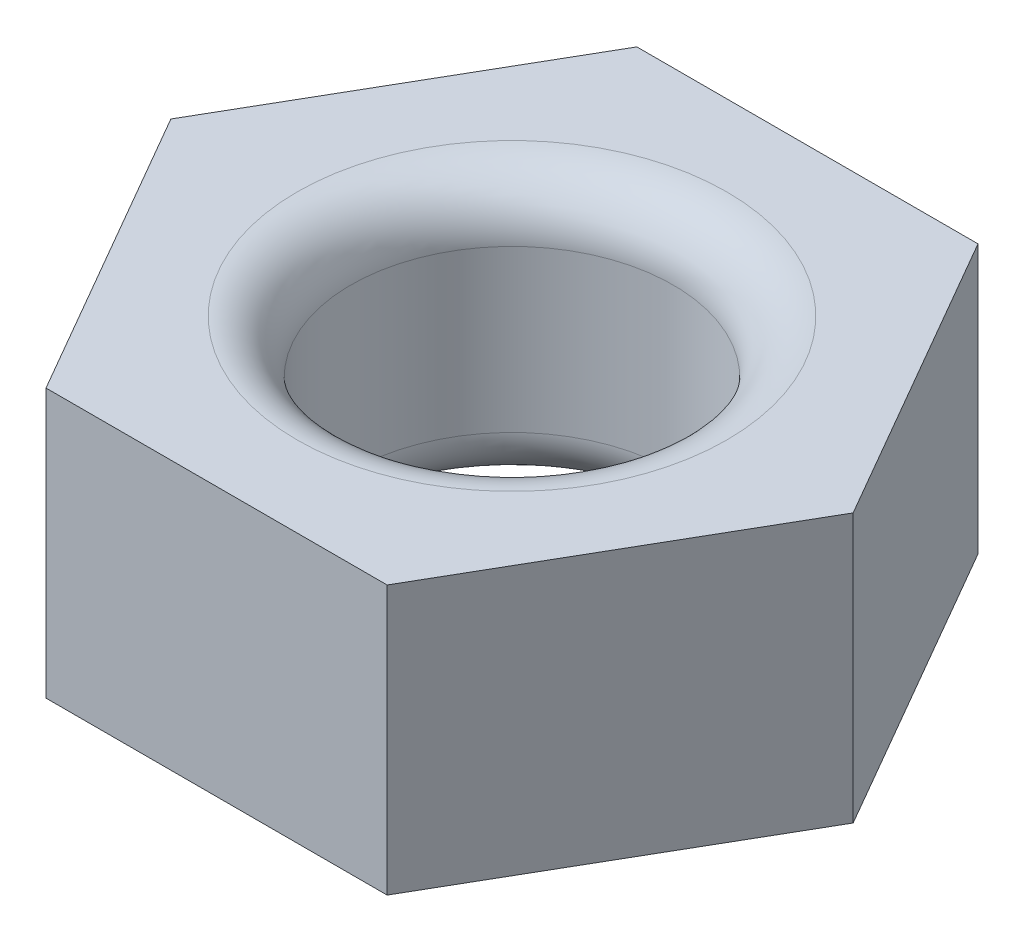
ISO-10303-21;
HEADER;
FILE_DESCRIPTION(('STEP AP214'),'2;1');
FILE_NAME('part.step','',(''),(''),'','','');
FILE_SCHEMA(('AUTOMOTIVE_DESIGN { 1 0 10303 214 1 1 1 1 }'));
ENDSEC;
DATA;
#1=APPLICATION_CONTEXT('core data for automotive mechanical design processes');
#2=APPLICATION_PROTOCOL_DEFINITION('international standard','automotive_design',2000,#1);
#3=PRODUCT_CONTEXT('',#1,'mechanical');
#4=PRODUCT('Part','Part','',(#3));
#5=PRODUCT_RELATED_PRODUCT_CATEGORY('part','',(#4));
#6=PRODUCT_DEFINITION_FORMATION('','',#4);
#7=PRODUCT_DEFINITION_CONTEXT('part definition',#1,'design');
#8=PRODUCT_DEFINITION('design','',#6,#7);
#9=PRODUCT_DEFINITION_SHAPE('','',#8);
#10=(LENGTH_UNIT() NAMED_UNIT(*) SI_UNIT(.MILLI.,.METRE.));
#11=(NAMED_UNIT(*) PLANE_ANGLE_UNIT() SI_UNIT($,.RADIAN.));
#12=(NAMED_UNIT(*) SI_UNIT($,.STERADIAN.) SOLID_ANGLE_UNIT());
#13=UNCERTAINTY_MEASURE_WITH_UNIT(LENGTH_MEASURE(1.E-05),#10,'distance_accuracy_value','');
#14=(GEOMETRIC_REPRESENTATION_CONTEXT(3) GLOBAL_UNCERTAINTY_ASSIGNED_CONTEXT((#13)) GLOBAL_UNIT_ASSIGNED_CONTEXT((#10,
#11,#12)) REPRESENTATION_CONTEXT('',''));
#15=CARTESIAN_POINT('',(0.,0.,0.));
#16=DIRECTION('',(0.,0.,1.));
#17=DIRECTION('',(1.,0.,0.));
#18=AXIS2_PLACEMENT_3D('',#15,#16,#17);
#19=CARTESIAN_POINT('',(0.,2.5,0.));
#20=DIRECTION('',(0.,1.,0.));
#21=DIRECTION('',(0.,0.,1.));
#22=AXIS2_PLACEMENT_3D('',#19,#20,#21);
#23=PLANE('',#22);
#24=CARTESIAN_POINT('',(0.,2.5,0.));
#25=DIRECTION('',(0.,1.,0.));
#26=DIRECTION('',(0.,0.,1.));
#27=AXIS2_PLACEMENT_3D('',#24,#25,#26);
#28=CIRCLE('',#27,2.);
#29=CARTESIAN_POINT('',(0.,2.5,2.));
#30=VERTEX_POINT('',#29);
#31=EDGE_CURVE('E11',#30,#30,#28,.F.);
#32=ORIENTED_EDGE('',*,*,#31,.T.);
#33=EDGE_LOOP('',(#32));
#34=FACE_BOUND('',#33,.T.);
#35=DIRECTION('',(-0.5,0.,0.866025403784439));
#36=VECTOR('',#35,1.);
#37=CARTESIAN_POINT('',(-1.58771324027147,2.5,-2.75));
#38=LINE('',#37,#36);
#39=CARTESIAN_POINT('',(-1.58771324027147,2.5,-2.75));
#40=VERTEX_POINT('',#39);
#41=CARTESIAN_POINT('',(-3.17542648054294,2.5,0.));
#42=VERTEX_POINT('',#41);
#43=EDGE_CURVE('E128',#40,#42,#38,.T.);
#44=ORIENTED_EDGE('',*,*,#43,.T.);
#45=DIRECTION('',(0.5,0.,0.866025403784439));
#46=VECTOR('',#45,1.);
#47=CARTESIAN_POINT('',(-3.17542648054294,2.5,0.));
#48=LINE('',#47,#46);
#49=CARTESIAN_POINT('',(-1.58771324027147,2.5,2.75));
#50=VERTEX_POINT('',#49);
#51=EDGE_CURVE('E88',#42,#50,#48,.T.);
#52=ORIENTED_EDGE('',*,*,#51,.T.);
#53=DIRECTION('',(1.,0.,0.));
#54=VECTOR('',#53,1.);
#55=CARTESIAN_POINT('',(-1.58771324027147,2.5,2.75));
#56=LINE('',#55,#54);
#57=CARTESIAN_POINT('',(1.58771324027147,2.5,2.75));
#58=VERTEX_POINT('',#57);
#59=EDGE_CURVE('E100',#50,#58,#56,.T.);
#60=ORIENTED_EDGE('',*,*,#59,.T.);
#61=DIRECTION('',(0.5,0.,-0.866025403784439));
#62=VECTOR('',#61,1.);
#63=CARTESIAN_POINT('',(1.58771324027147,2.5,2.75));
#64=LINE('',#63,#62);
#65=CARTESIAN_POINT('',(3.17542648054294,2.5,0.));
#66=VERTEX_POINT('',#65);
#67=EDGE_CURVE('E95',#58,#66,#64,.T.);
#68=ORIENTED_EDGE('',*,*,#67,.T.);
#69=DIRECTION('',(-0.5,0.,-0.866025403784439));
#70=VECTOR('',#69,1.);
#71=CARTESIAN_POINT('',(3.17542648054294,2.5,0.));
#72=LINE('',#71,#70);
#73=CARTESIAN_POINT('',(1.58771324027147,2.5,-2.75));
#74=VERTEX_POINT('',#73);
#75=EDGE_CURVE('E98',#66,#74,#72,.T.);
#76=ORIENTED_EDGE('',*,*,#75,.T.);
#77=DIRECTION('',(-1.,0.,0.));
#78=VECTOR('',#77,1.);
#79=CARTESIAN_POINT('',(1.58771324027147,2.5,-2.75));
#80=LINE('',#79,#78);
#81=EDGE_CURVE('E50',#74,#40,#80,.T.);
#82=ORIENTED_EDGE('',*,*,#81,.T.);
#83=EDGE_LOOP('',(#44,#52,#60,#68,#76,#82));
#84=FACE_BOUND('',#83,.T.);
#85=ADVANCED_FACE('F33',(#34,#84),#23,.T.);
#86=CARTESIAN_POINT('',(0.,0.,0.));
#87=DIRECTION('',(0.,1.,0.));
#88=DIRECTION('',(0.,0.,1.));
#89=AXIS2_PLACEMENT_3D('',#86,#87,#88);
#90=PLANE('',#89);
#91=CARTESIAN_POINT('',(0.,0.,0.));
#92=DIRECTION('',(0.,1.,0.));
#93=DIRECTION('',(0.,0.,1.));
#94=AXIS2_PLACEMENT_3D('',#91,#92,#93);
#95=CIRCLE('',#94,2.);
#96=CARTESIAN_POINT('',(0.,0.,2.));
#97=VERTEX_POINT('',#96);
#98=EDGE_CURVE('E137',#97,#97,#95,.T.);
#99=ORIENTED_EDGE('',*,*,#98,.T.);
#100=EDGE_LOOP('',(#99));
#101=FACE_BOUND('',#100,.T.);
#102=DIRECTION('',(-0.5,0.,0.866025403784439));
#103=VECTOR('',#102,1.);
#104=CARTESIAN_POINT('',(-1.58771324027147,0.,-2.75));
#105=LINE('',#104,#103);
#106=CARTESIAN_POINT('',(-1.58771324027147,0.,-2.75));
#107=VERTEX_POINT('',#106);
#108=CARTESIAN_POINT('',(-3.17542648054294,0.,0.));
#109=VERTEX_POINT('',#108);
#110=EDGE_CURVE('E118',#107,#109,#105,.T.);
#111=ORIENTED_EDGE('',*,*,#110,.F.);
#112=DIRECTION('',(-1.,0.,0.));
#113=VECTOR('',#112,1.);
#114=CARTESIAN_POINT('',(1.58771324027147,0.,-2.75));
#115=LINE('',#114,#113);
#116=CARTESIAN_POINT('',(1.58771324027147,0.,-2.75));
#117=VERTEX_POINT('',#116);
#118=EDGE_CURVE('E79',#117,#107,#115,.T.);
#119=ORIENTED_EDGE('',*,*,#118,.F.);
#120=DIRECTION('',(-0.5,0.,-0.866025403784439));
#121=VECTOR('',#120,1.);
#122=CARTESIAN_POINT('',(3.17542648054294,0.,0.));
#123=LINE('',#122,#121);
#124=CARTESIAN_POINT('',(3.17542648054294,0.,0.));
#125=VERTEX_POINT('',#124);
#126=EDGE_CURVE('E73',#125,#117,#123,.T.);
#127=ORIENTED_EDGE('',*,*,#126,.F.);
#128=DIRECTION('',(0.5,0.,-0.866025403784439));
#129=VECTOR('',#128,1.);
#130=CARTESIAN_POINT('',(1.58771324027147,0.,2.75));
#131=LINE('',#130,#129);
#132=CARTESIAN_POINT('',(1.58771324027147,0.,2.75));
#133=VERTEX_POINT('',#132);
#134=EDGE_CURVE('E108',#133,#125,#131,.T.);
#135=ORIENTED_EDGE('',*,*,#134,.F.);
#136=DIRECTION('',(1.,0.,0.));
#137=VECTOR('',#136,1.);
#138=CARTESIAN_POINT('',(-1.58771324027147,0.,2.75));
#139=LINE('',#138,#137);
#140=CARTESIAN_POINT('',(-1.58771324027147,0.,2.75));
#141=VERTEX_POINT('',#140);
#142=EDGE_CURVE('E123',#141,#133,#139,.T.);
#143=ORIENTED_EDGE('',*,*,#142,.F.);
#144=DIRECTION('',(0.5,0.,0.866025403784439));
#145=VECTOR('',#144,1.);
#146=CARTESIAN_POINT('',(-3.17542648054294,0.,0.));
#147=LINE('',#146,#145);
#148=EDGE_CURVE('E121',#109,#141,#147,.T.);
#149=ORIENTED_EDGE('',*,*,#148,.F.);
#150=EDGE_LOOP('',(#111,#119,#127,#135,#143,#149));
#151=FACE_BOUND('',#150,.T.);
#152=ADVANCED_FACE('F153',(#101,#151),#90,.F.);
#153=CARTESIAN_POINT('',(-1.58771324027147,2.5,-2.75));
#154=DIRECTION('',(0.866025403784439,0.,0.5));
#155=DIRECTION('',(0.5,0.,-0.866025403784439));
#156=AXIS2_PLACEMENT_3D('',#153,#154,#155);
#157=PLANE('',#156);
#158=ORIENTED_EDGE('',*,*,#110,.T.);
#159=DIRECTION('',(0.,-1.,0.));
#160=VECTOR('',#159,1.);
#161=CARTESIAN_POINT('',(-3.17542648054294,2.5,0.));
#162=LINE('',#161,#160);
#163=EDGE_CURVE('E135',#42,#109,#162,.T.);
#164=ORIENTED_EDGE('',*,*,#163,.F.);
#165=ORIENTED_EDGE('',*,*,#43,.F.);
#166=DIRECTION('',(0.,-1.,0.));
#167=VECTOR('',#166,1.);
#168=CARTESIAN_POINT('',(-1.58771324027147,2.5,-2.75));
#169=LINE('',#168,#167);
#170=EDGE_CURVE('E114',#40,#107,#169,.T.);
#171=ORIENTED_EDGE('',*,*,#170,.T.);
#172=EDGE_LOOP('',(#158,#164,#165,#171));
#173=FACE_BOUND('',#172,.T.);
#174=ADVANCED_FACE('F156',(#173),#157,.F.);
#175=CARTESIAN_POINT('',(-3.17542648054294,2.5,0.));
#176=DIRECTION('',(0.866025403784438,0.,-0.5));
#177=DIRECTION('',(-0.5,0.,-0.866025403784439));
#178=AXIS2_PLACEMENT_3D('',#175,#176,#177);
#179=PLANE('',#178);
#180=ORIENTED_EDGE('',*,*,#148,.T.);
#181=DIRECTION('',(0.,-1.,0.));
#182=VECTOR('',#181,1.);
#183=CARTESIAN_POINT('',(-1.58771324027147,2.5,2.75));
#184=LINE('',#183,#182);
#185=EDGE_CURVE('E132',#50,#141,#184,.T.);
#186=ORIENTED_EDGE('',*,*,#185,.F.);
#187=ORIENTED_EDGE('',*,*,#51,.F.);
#188=ORIENTED_EDGE('',*,*,#163,.T.);
#189=EDGE_LOOP('',(#180,#186,#187,#188));
#190=FACE_BOUND('',#189,.T.);
#191=ADVANCED_FACE('F232',(#190),#179,.F.);
#192=CARTESIAN_POINT('',(-1.58771324027147,2.5,2.75));
#193=DIRECTION('',(0.,0.,-1.));
#194=DIRECTION('',(-1.,0.,0.));
#195=AXIS2_PLACEMENT_3D('',#192,#193,#194);
#196=PLANE('',#195);
#197=ORIENTED_EDGE('',*,*,#142,.T.);
#198=DIRECTION('',(0.,-1.,0.));
#199=VECTOR('',#198,1.);
#200=CARTESIAN_POINT('',(1.58771324027147,2.5,2.75));
#201=LINE('',#200,#199);
#202=EDGE_CURVE('E109',#58,#133,#201,.T.);
#203=ORIENTED_EDGE('',*,*,#202,.F.);
#204=ORIENTED_EDGE('',*,*,#59,.F.);
#205=ORIENTED_EDGE('',*,*,#185,.T.);
#206=EDGE_LOOP('',(#197,#203,#204,#205));
#207=FACE_BOUND('',#206,.T.);
#208=ADVANCED_FACE('F223',(#207),#196,.F.);
#209=CARTESIAN_POINT('',(1.58771324027147,2.5,2.75));
#210=DIRECTION('',(-0.866025403784439,0.,-0.5));
#211=DIRECTION('',(-0.5,0.,0.866025403784439));
#212=AXIS2_PLACEMENT_3D('',#209,#210,#211);
#213=PLANE('',#212);
#214=ORIENTED_EDGE('',*,*,#134,.T.);
#215=DIRECTION('',(0.,-1.,0.));
#216=VECTOR('',#215,1.);
#217=CARTESIAN_POINT('',(3.17542648054294,2.5,0.));
#218=LINE('',#217,#216);
#219=EDGE_CURVE('E105',#66,#125,#218,.T.);
#220=ORIENTED_EDGE('',*,*,#219,.F.);
#221=ORIENTED_EDGE('',*,*,#67,.F.);
#222=ORIENTED_EDGE('',*,*,#202,.T.);
#223=EDGE_LOOP('',(#214,#220,#221,#222));
#224=FACE_BOUND('',#223,.T.);
#225=ADVANCED_FACE('F106',(#224),#213,.F.);
#226=CARTESIAN_POINT('',(3.17542648054294,2.5,0.));
#227=DIRECTION('',(-0.866025403784439,0.,0.5));
#228=DIRECTION('',(0.5,0.,0.866025403784439));
#229=AXIS2_PLACEMENT_3D('',#226,#227,#228);
#230=PLANE('',#229);
#231=ORIENTED_EDGE('',*,*,#126,.T.);
#232=DIRECTION('',(0.,-1.,0.));
#233=VECTOR('',#232,1.);
#234=CARTESIAN_POINT('',(1.58771324027147,2.5,-2.75));
#235=LINE('',#234,#233);
#236=EDGE_CURVE('E110',#74,#117,#235,.T.);
#237=ORIENTED_EDGE('',*,*,#236,.F.);
#238=ORIENTED_EDGE('',*,*,#75,.F.);
#239=ORIENTED_EDGE('',*,*,#219,.T.);
#240=EDGE_LOOP('',(#231,#237,#238,#239));
#241=FACE_BOUND('',#240,.T.);
#242=ADVANCED_FACE('F112',(#241),#230,.F.);
#243=CARTESIAN_POINT('',(1.58771324027147,2.5,-2.75));
#244=DIRECTION('',(0.,0.,1.));
#245=DIRECTION('',(1.,0.,0.));
#246=AXIS2_PLACEMENT_3D('',#243,#244,#245);
#247=PLANE('',#246);
#248=ORIENTED_EDGE('',*,*,#118,.T.);
#249=ORIENTED_EDGE('',*,*,#170,.F.);
#250=ORIENTED_EDGE('',*,*,#81,.F.);
#251=ORIENTED_EDGE('',*,*,#236,.T.);
#252=EDGE_LOOP('',(#248,#249,#250,#251));
#253=FACE_BOUND('',#252,.T.);
#254=ADVANCED_FACE('F163',(#253),#247,.F.);
#255=CARTESIAN_POINT('',(0.,2.5,0.));
#256=DIRECTION('',(0.,-1.,0.));
#257=DIRECTION('',(0.,0.,-1.));
#258=AXIS2_PLACEMENT_3D('',#255,#256,#257);
#259=CYLINDRICAL_SURFACE('',#258,1.5);
#260=CARTESIAN_POINT('',(0.,0.5,0.));
#261=DIRECTION('',(0.,1.,0.));
#262=DIRECTION('',(0.,0.,1.));
#263=AXIS2_PLACEMENT_3D('',#260,#261,#262);
#264=CIRCLE('',#263,1.5);
#265=CARTESIAN_POINT('',(0.,0.5,1.5));
#266=VERTEX_POINT('',#265);
#267=EDGE_CURVE('E42',#266,#266,#264,.F.);
#268=ORIENTED_EDGE('',*,*,#267,.T.);
#269=EDGE_LOOP('',(#268));
#270=FACE_BOUND('',#269,.T.);
#271=CARTESIAN_POINT('',(0.,2.,0.));
#272=DIRECTION('',(0.,1.,0.));
#273=DIRECTION('',(0.,0.,1.));
#274=AXIS2_PLACEMENT_3D('',#271,#272,#273);
#275=CIRCLE('',#274,1.5);
#276=CARTESIAN_POINT('',(0.,2.,1.5));
#277=VERTEX_POINT('',#276);
#278=EDGE_CURVE('E140',#277,#277,#275,.T.);
#279=ORIENTED_EDGE('',*,*,#278,.T.);
#280=EDGE_LOOP('',(#279));
#281=FACE_BOUND('',#280,.T.);
#282=ADVANCED_FACE('F145',(#270,#281),#259,.F.);
#283=CARTESIAN_POINT('',(0.,0.5,0.));
#284=DIRECTION('',(0.,1.,0.));
#285=DIRECTION('',(0.,0.,1.));
#286=AXIS2_PLACEMENT_3D('',#283,#284,#285);
#287=TOROIDAL_SURFACE('',#286,2.,0.5);
#288=ORIENTED_EDGE('',*,*,#267,.F.);
#289=EDGE_LOOP('',(#288));
#290=FACE_BOUND('',#289,.T.);
#291=ORIENTED_EDGE('',*,*,#98,.F.);
#292=EDGE_LOOP('',(#291));
#293=FACE_BOUND('',#292,.T.);
#294=ADVANCED_FACE('F148',(#290,#293),#287,.T.);
#295=CARTESIAN_POINT('',(0.,2.,0.));
#296=DIRECTION('',(0.,1.,0.));
#297=DIRECTION('',(0.,0.,1.));
#298=AXIS2_PLACEMENT_3D('',#295,#296,#297);
#299=TOROIDAL_SURFACE('',#298,2.,0.5);
#300=ORIENTED_EDGE('',*,*,#31,.F.);
#301=EDGE_LOOP('',(#300));
#302=FACE_BOUND('',#301,.T.);
#303=ORIENTED_EDGE('',*,*,#278,.F.);
#304=EDGE_LOOP('',(#303));
#305=FACE_BOUND('',#304,.T.);
#306=ADVANCED_FACE('F35',(#302,#305),#299,.T.);
#307=CLOSED_SHELL('',(#85,#152,#174,#191,#208,#225,#242,#254,#282,#294,#306));
#308=MANIFOLD_SOLID_BREP('B2',#307);
#309=ADVANCED_BREP_SHAPE_REPRESENTATION('',(#18,#308),#14);
#310=SHAPE_DEFINITION_REPRESENTATION(#9,#309);
ENDSEC;
END-ISO-10303-21;
